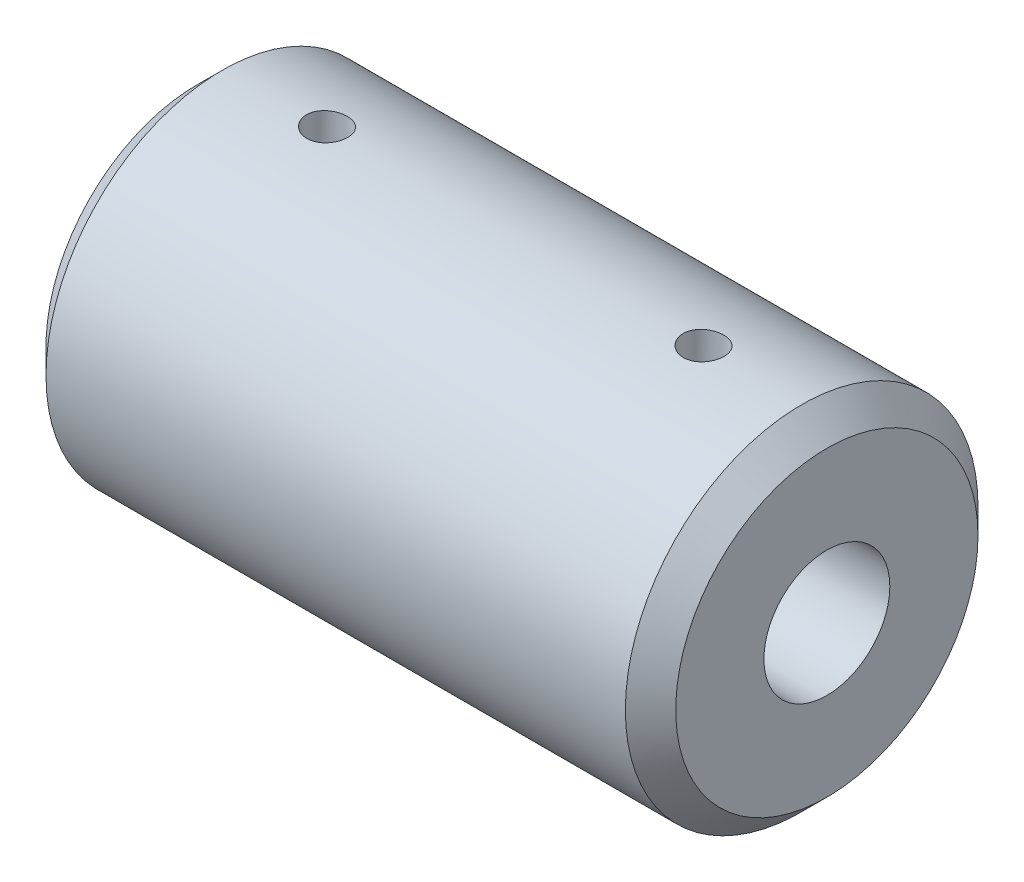
ISO-10303-21;
HEADER;
FILE_DESCRIPTION(('STEP AP214'),'2;1');
FILE_NAME('part.step','',(''),(''),'','','');
FILE_SCHEMA(('AUTOMOTIVE_DESIGN { 1 0 10303 214 1 1 1 1 }'));
ENDSEC;
DATA;
#1=APPLICATION_CONTEXT('core data for automotive mechanical design processes');
#2=APPLICATION_PROTOCOL_DEFINITION('international standard','automotive_design',2000,#1);
#3=PRODUCT_CONTEXT('',#1,'mechanical');
#4=PRODUCT('Part','Part','',(#3));
#5=PRODUCT_RELATED_PRODUCT_CATEGORY('part','',(#4));
#6=PRODUCT_DEFINITION_FORMATION('','',#4);
#7=PRODUCT_DEFINITION_CONTEXT('part definition',#1,'design');
#8=PRODUCT_DEFINITION('design','',#6,#7);
#9=PRODUCT_DEFINITION_SHAPE('','',#8);
#10=(LENGTH_UNIT() NAMED_UNIT(*) SI_UNIT(.MILLI.,.METRE.));
#11=(NAMED_UNIT(*) PLANE_ANGLE_UNIT() SI_UNIT($,.RADIAN.));
#12=(NAMED_UNIT(*) SI_UNIT($,.STERADIAN.) SOLID_ANGLE_UNIT());
#13=UNCERTAINTY_MEASURE_WITH_UNIT(LENGTH_MEASURE(1.E-05),#10,'distance_accuracy_value','');
#14=(GEOMETRIC_REPRESENTATION_CONTEXT(3) GLOBAL_UNCERTAINTY_ASSIGNED_CONTEXT((#13)) GLOBAL_UNIT_ASSIGNED_CONTEXT((#10,
#11,#12)) REPRESENTATION_CONTEXT('',''));
#15=CARTESIAN_POINT('',(0.,0.,0.));
#16=DIRECTION('',(0.,0.,1.));
#17=DIRECTION('',(1.,0.,0.));
#18=AXIS2_PLACEMENT_3D('',#15,#16,#17);
#19=CARTESIAN_POINT('',(25.,0.,0.));
#20=DIRECTION('',(-1.,0.,0.));
#21=DIRECTION('',(0.,0.,1.));
#22=AXIS2_PLACEMENT_3D('',#19,#20,#21);
#23=CYLINDRICAL_SURFACE('',#22,7.);
#24=CARTESIAN_POINT('',(20.,6.96538869352867,0.695241215739531));
#25=CARTESIAN_POINT('',(19.955221364251,6.96538925839416,0.695239285953402));
#26=CARTESIAN_POINT('',(19.9104140020312,6.9657690362752,0.691462776120836));
#27=CARTESIAN_POINT('',(19.822044131321,6.96724200480922,0.676456572404508));
#28=CARTESIAN_POINT('',(19.7784830081984,6.96833595948155,0.665218896418912));
#29=CARTESIAN_POINT('',(19.6938979878882,6.97109743183187,0.63562572567224));
#30=CARTESIAN_POINT('',(19.6528724722858,6.97276457910044,0.617274826655859));
#31=CARTESIAN_POINT('',(19.5744871735817,6.97646095200438,0.573987983750679));
#32=CARTESIAN_POINT('',(19.5371267194929,6.97849011117137,0.549053248305771));
#33=CARTESIAN_POINT('',(19.4669481745153,6.98266105415699,0.493183832896569));
#34=CARTESIAN_POINT('',(19.4341497888337,6.98480327457963,0.462224430883516));
#35=CARTESIAN_POINT('',(19.3741963910025,6.98891323433626,0.395240979401169));
#36=CARTESIAN_POINT('',(19.3470416491577,6.99088096531041,0.359216687485229));
#37=CARTESIAN_POINT('',(19.2990767037635,6.99438089694422,0.283006515803443));
#38=CARTESIAN_POINT('',(19.278284176785,6.99591188338329,0.242809449620369));
#39=CARTESIAN_POINT('',(19.2437470375765,6.99830717949623,0.159475052535296));
#40=CARTESIAN_POINT('',(19.230002204787,6.99917151003371,0.116337813694652));
#41=CARTESIAN_POINT('',(19.2100090629886,7.00007873815906,0.028550191831092));
#42=CARTESIAN_POINT('',(19.2037281405702,7.00012522171129,-0.0160927252066312));
#43=CARTESIAN_POINT('',(19.1987401114317,6.99934420645058,-0.105791359082252));
#44=CARTESIAN_POINT('',(19.2000327529574,6.99851673668962,-0.150847062148953));
#45=CARTESIAN_POINT('',(19.2101288690891,6.99603004105086,-0.239870894467514));
#46=CARTESIAN_POINT('',(19.2188972718336,6.99437471395835,-0.283843117243878));
#47=CARTESIAN_POINT('',(19.2436412681985,6.99036381958259,-0.369676697891015));
#48=CARTESIAN_POINT('',(19.2596169794827,6.9880082408675,-0.411538021287656));
#49=CARTESIAN_POINT('',(19.2983599236096,6.98280014790737,-0.492073057049043));
#50=CARTESIAN_POINT('',(19.3211424895972,6.97994651784992,-0.530739318476951));
#51=CARTESIAN_POINT('',(19.3728412862227,6.97401450959707,-0.603708408600039));
#52=CARTESIAN_POINT('',(19.4017577520671,6.97093612278626,-0.638011069890793));
#53=CARTESIAN_POINT('',(19.4651003222049,6.96483592108967,-0.7014879410634));
#54=CARTESIAN_POINT('',(19.49955696716,6.9618145300125,-0.730631724116504));
#55=CARTESIAN_POINT('',(19.5728964430676,6.95614987888132,-0.78273099332546));
#56=CARTESIAN_POINT('',(19.611779284114,6.95350661968966,-0.805686465368742));
#57=CARTESIAN_POINT('',(19.6928928241026,6.94886807581585,-0.844761300259147));
#58=CARTESIAN_POINT('',(19.7351245856321,6.9468729978284,-0.860878482984606));
#59=CARTESIAN_POINT('',(19.8217242306132,6.94373997334948,-0.885795867976903));
#60=CARTESIAN_POINT('',(19.866092028422,6.9426019925237,-0.894596363343199));
#61=CARTESIAN_POINT('',(19.9554362895972,6.9413067028803,-0.904592157429438));
#62=CARTESIAN_POINT('',(20.0004079061996,6.94114389703032,-0.905830086897612));
#63=CARTESIAN_POINT('',(20.0899182903648,6.94180129102909,-0.900778035892552));
#64=CARTESIAN_POINT('',(20.1344570655931,6.94262147343711,-0.894488188981322));
#65=CARTESIAN_POINT('',(20.2217110841727,6.94515546264809,-0.874593997091442));
#66=CARTESIAN_POINT('',(20.2644310614229,6.94686677388075,-0.861010075578955));
#67=CARTESIAN_POINT('',(20.3469824835424,6.95100537608892,-0.826932371766027));
#68=CARTESIAN_POINT('',(20.3868138427959,6.95343268827521,-0.80643838475944));
#69=CARTESIAN_POINT('',(20.4626512480253,6.95876912039641,-0.759013890761151));
#70=CARTESIAN_POINT('',(20.4986395651425,6.96168032721783,-0.732055270629953));
#71=CARTESIAN_POINT('',(20.5655889233034,6.96768486145551,-0.672503536171158));
#72=CARTESIAN_POINT('',(20.5965498013104,6.9707781947736,-0.639910239185194));
#73=CARTESIAN_POINT('',(20.6527141932698,6.97685744363171,-0.569825311814617));
#74=CARTESIAN_POINT('',(20.6778897350807,6.97984278081407,-0.532311205771822));
#75=CARTESIAN_POINT('',(20.7215757516774,6.98540212562178,-0.453556282285454));
#76=CARTESIAN_POINT('',(20.7400863416075,6.98797614035274,-0.41231552923904));
#77=CARTESIAN_POINT('',(20.7698702644959,6.99246965270981,-0.327370514788207));
#78=CARTESIAN_POINT('',(20.7811600940248,6.99439063750797,-0.28367211862554));
#79=CARTESIAN_POINT('',(20.7962357678077,6.99742479669428,-0.194972692693371));
#80=CARTESIAN_POINT('',(20.8000218922175,6.99853800124046,-0.149971711620372));
#81=CARTESIAN_POINT('',(20.7999780410009,6.99988406818172,-0.0602177962375493));
#82=CARTESIAN_POINT('',(20.7961913281802,7.0001219093855,-0.0154649092355182));
#83=CARTESIAN_POINT('',(20.781200508537,6.99976078144271,0.0727767154692455));
#84=CARTESIAN_POINT('',(20.769996401376,6.99916181225797,0.116265453114302));
#85=CARTESIAN_POINT('',(20.7405017141113,6.99724872389234,0.200739440982885));
#86=CARTESIAN_POINT('',(20.7222128466136,6.99593477751256,0.241725293461626));
#87=CARTESIAN_POINT('',(20.6790722934083,6.99278913757714,0.320060456001504));
#88=CARTESIAN_POINT('',(20.6542205820971,6.9909574420016,0.357409751874615));
#89=CARTESIAN_POINT('',(20.5984985952844,6.98701495271322,0.427630242909399));
#90=CARTESIAN_POINT('',(20.5675960872779,6.98490268468076,0.460475778948456));
#91=CARTESIAN_POINT('',(20.5007156067257,6.98068440306025,0.520532526873109));
#92=CARTESIAN_POINT('',(20.4647364272605,6.97857839108141,0.547742395137108));
#93=CARTESIAN_POINT('',(20.3885921505397,6.97463816418728,0.59582560907302));
#94=CARTESIAN_POINT('',(20.3484138402551,6.97280485405007,0.616678092056966));
#95=CARTESIAN_POINT('',(20.2651302650528,6.96965631316451,0.65130322133391));
#96=CARTESIAN_POINT('',(20.2220282975461,6.9683405097794,0.665083698192455));
#97=CARTESIAN_POINT('',(20.1489111492484,6.96671932448092,0.681809572172233));
#98=CARTESIAN_POINT('',(20.1193601819325,6.96622302712169,0.686839331088369));
#99=CARTESIAN_POINT('',(20.0598770904353,6.96555752374466,0.693555788201022));
#100=CARTESIAN_POINT('',(20.0299449685188,6.96538831578426,0.695242506251935));
#101=CARTESIAN_POINT('',(20.,6.96538869352867,0.695241215739531));
#102=B_SPLINE_CURVE_WITH_KNOTS('',3,(#24,#25,#26,#27,#28,#29,#30,#31,#32,#33,#34,#35,#36,#37,
#38,#39,#40,#41,#42,#43,#44,#45,#46,#47,#48,#49,#50,#51,#52,#53,#54,#55,#56,#57,#58,#59,#60,#61,
#62,#63,#64,#65,#66,#67,#68,#69,#70,#71,#72,#73,#74,#75,#76,#77,#78,#79,#80,#81,#82,#83,#84,#85,
#86,#87,#88,#89,#90,#91,#92,#93,#94,#95,#96,#97,#98,#99,#100,#101),.UNSPECIFIED.,.T.,.F.,(4,2,2,
2,2,2,2,2,2,2,2,2,2,2,2,2,2,2,2,2,2,2,2,2,2,2,2,2,2,2,2,2,2,2,2,2,2,2,4),(0.,0.134226532267942,
0.268596894592968,0.402880586594352,0.537139648330196,0.671961720103514,0.806790247751585,
0.941990046594601,1.0771856140657,1.21178824923483,1.34638641008098,1.4803565686245,
1.61432891439222,1.74860535170543,1.88288693882488,2.01793588104796,2.1529851312503,
2.2880774043422,2.42316426550677,2.55748892399054,2.69181119924671,2.82575931745103,
2.95971140412898,3.09425693171072,3.22880682165022,3.36399418052668,3.49917920378686,
3.63405426922176,3.7689242989137,3.90302603165032,4.03712777050519,4.17119711302067,
4.30526697858673,4.44007147888764,4.57490808155491,4.71018252196539,4.84530685315236,
4.93506914911104,5.02483091196778),.UNSPECIFIED.);
#103=CARTESIAN_POINT('',(20.,6.96538869352867,0.695241215739531));
#104=VERTEX_POINT('',#103);
#105=EDGE_CURVE('E124',#104,#104,#102,.T.);
#106=ORIENTED_EDGE('',*,*,#105,.T.);
#107=EDGE_LOOP('',(#106));
#108=FACE_BOUND('',#107,.T.);
#109=CARTESIAN_POINT('',(5.,6.97042438267503,0.64279384363067));
#110=CARTESIAN_POINT('',(4.95522136425099,6.97042493299924,0.642791909647529));
#111=CARTESIAN_POINT('',(4.91041400203123,6.970776274768,0.63901264824933));
#112=CARTESIAN_POINT('',(4.82204413132101,6.97213625161118,0.623995782755354));
#113=CARTESIAN_POINT('',(4.77848300819841,6.97314559060294,0.61275019103317));
#114=CARTESIAN_POINT('',(4.69389798788819,6.97568424034319,0.583137073299982));
#115=CARTESIAN_POINT('',(4.65287247228576,6.9772132152844,0.564774145691518));
#116=CARTESIAN_POINT('',(4.57448717358165,6.98058366840321,0.521460706817232));
#117=CARTESIAN_POINT('',(4.53712671949286,6.98242508921016,0.496511404461368));
#118=CARTESIAN_POINT('',(4.46694817451531,6.98617539139459,0.440612177480301));
#119=CARTESIAN_POINT('',(4.43414978883369,6.98808452328372,0.409637528220382));
#120=CARTESIAN_POINT('',(4.37419639100247,6.99169018989835,0.342625039011629));
#121=CARTESIAN_POINT('',(4.34704164915768,6.99338671443939,0.30658695668594));
#122=CARTESIAN_POINT('',(4.29907670376348,6.99631292175242,0.23035260025808));
#123=CARTESIAN_POINT('',(4.27828417678503,6.99754130613933,0.190145149194863));
#124=CARTESIAN_POINT('',(4.2437470375765,6.9993092859996,0.10679508363871));
#125=CARTESIAN_POINT('',(4.23000220478696,6.9998489030289,0.0636525610474829));
#126=CARTESIAN_POINT('',(4.2100090629886,7.00009533814513,-0.0241394026226872));
#127=CARTESIAN_POINT('',(4.20372814057022,6.99980579829044,-0.0687814049190696));
#128=CARTESIAN_POINT('',(4.19874011143168,6.99834965387703,-0.158471619253954));
#129=CARTESIAN_POINT('',(4.20003275295743,6.99718307847313,-0.203519817740321));
#130=CARTESIAN_POINT('',(4.21012886908908,6.99402638115268,-0.292522411173941));
#131=CARTESIAN_POINT('',(4.21889727183355,6.99204012709952,-0.336480928875447));
#132=CARTESIAN_POINT('',(4.2436412681985,6.98738328687522,-0.422281888540987));
#133=CARTESIAN_POINT('',(4.2596169794827,6.98471268953207,-0.464124295945818));
#134=CARTESIAN_POINT('',(4.29835992360963,6.97889856617346,-0.544617849643864));
#135=CARTESIAN_POINT('',(4.32114248959717,6.97575398045957,-0.583261536812715));
#136=CARTESIAN_POINT('',(4.37284128622265,6.96927291031551,-0.65618391036906));
#137=CARTESIAN_POINT('',(4.40175775206706,6.96593641853022,-0.690462429292023));
#138=CARTESIAN_POINT('',(4.46510032220488,6.95935860654471,-0.753891586815091));
#139=CARTESIAN_POINT('',(4.49955696715997,6.9561179391603,-0.783011802638317));
#140=CARTESIAN_POINT('',(4.57289644306764,6.95006130330055,-0.835066958834488));
#141=CARTESIAN_POINT('',(4.61177928411396,6.94724533579376,-0.858001885101753));
#142=CARTESIAN_POINT('',(4.69289282410262,6.94231281154011,-0.897040699318745));
#143=CARTESIAN_POINT('',(4.73512458563211,6.94019647789163,-0.913142408764333));
#144=CARTESIAN_POINT('',(4.82172423061325,6.93687599187875,-0.938035505997866));
#145=CARTESIAN_POINT('',(4.866092028422,6.93567180297489,-0.946827186618536));
#146=CARTESIAN_POINT('',(4.95543628959718,6.93430131283389,-0.956812948054112));
#147=CARTESIAN_POINT('',(5.00040790619961,6.93412919384337,-0.9580496170341));
#148=CARTESIAN_POINT('',(5.08991829036478,6.9348245954254,-0.953002657269344));
#149=CARTESIAN_POINT('',(5.1344570655931,6.93569209755241,-0.946719161951546));
#150=CARTESIAN_POINT('',(5.22171108417274,6.93837575627104,-0.926844606657034));
#151=CARTESIAN_POINT('',(5.26443106142289,6.94018926363799,-0.913273950784068));
#152=CARTESIAN_POINT('',(5.34698248354243,6.94458424755849,-0.879228363085548));
#153=CARTESIAN_POINT('',(5.38681384279593,6.94716574686303,-0.858753226719297));
#154=CARTESIAN_POINT('',(5.46265124802526,6.95285898651627,-0.811370242842925));
#155=CARTESIAN_POINT('',(5.49863956514249,6.95597302529674,-0.784434298697432));
#156=CARTESIAN_POINT('',(5.56558892330345,6.96242562848181,-0.724929446621332));
#157=CARTESIAN_POINT('',(5.59654980131041,6.96576420016291,-0.692360356081953));
#158=CARTESIAN_POINT('',(5.65271419326981,6.97237079798073,-0.622323171840355));
#159=CARTESIAN_POINT('',(5.67788973508066,6.97563841494785,-0.584832598763399));
#160=CARTESIAN_POINT('',(5.72157575167746,6.98179038150409,-0.506121750746588));
#161=CARTESIAN_POINT('',(5.74008634160748,6.98467473771391,-0.46490154025555));
#162=CARTESIAN_POINT('',(5.76987026449595,6.98980749411288,-0.379992754225454));
#163=CARTESIAN_POINT('',(5.78116009402477,6.99205733728494,-0.336310054955775));
#164=CARTESIAN_POINT('',(5.79623576780771,6.99575904087525,-0.247635979413969));
#165=CARTESIAN_POINT('',(5.80002189221753,6.99721093108412,-0.202644652063962));
#166=CARTESIAN_POINT('',(5.79997804100093,6.99923252726916,-0.112903410866718));
#167=CARTESIAN_POINT('',(5.79619132818022,6.99980721155692,-0.0681535818008518));
#168=CARTESIAN_POINT('',(5.78120050853698,7.00011027838071,0.0200882614166817));
#169=CARTESIAN_POINT('',(5.76999640137604,6.99983866087812,0.0635802755109624));
#170=CARTESIAN_POINT('',(5.74050171411127,6.99856145267393,0.148066270046858));
#171=CARTESIAN_POINT('',(5.72221284661364,6.99755603930165,0.189060851425974));
#172=CARTESIAN_POINT('',(5.67907229340834,6.99500010821207,0.267417471803692));
#173=CARTESIAN_POINT('',(5.65422058209713,6.99344958836815,0.304779496629874));
#174=CARTESIAN_POINT('',(5.59849859528442,6.99003575230132,0.375027673163246));
#175=CARTESIAN_POINT('',(5.56759608727795,6.98817076866729,0.407888177571712));
#176=CARTESIAN_POINT('',(5.50071560672574,6.98440464675807,0.467974974764442));
#177=CARTESIAN_POINT('',(5.46473642726052,6.98250349997877,0.495199923953058));
#178=CARTESIAN_POINT('',(5.38859215053971,6.97892530150933,0.543311433450237));
#179=CARTESIAN_POINT('',(5.34841384025506,6.9772489975406,0.56417712485166));
#180=CARTESIAN_POINT('',(5.26513026505277,6.97436116520154,0.598824971993072));
#181=CARTESIAN_POINT('',(5.22202829754609,6.97314912315043,0.612614962386959));
#182=CARTESIAN_POINT('',(5.14891114924843,6.97165387750121,0.629352565041102));
#183=CARTESIAN_POINT('',(5.1193601819325,6.97119545261634,0.634385917050266));
#184=CARTESIAN_POINT('',(5.05987709043531,6.97058052208971,0.641107193070365));
#185=CARTESIAN_POINT('',(5.0299449685188,6.97042401465485,0.642795136949756));
#186=CARTESIAN_POINT('',(5.,6.97042438267503,0.64279384363067));
#187=B_SPLINE_CURVE_WITH_KNOTS('',3,(#109,#110,#111,#112,#113,#114,#115,#116,#117,#118,#119,
#120,#121,#122,#123,#124,#125,#126,#127,#128,#129,#130,#131,#132,#133,#134,#135,#136,#137,#138,
#139,#140,#141,#142,#143,#144,#145,#146,#147,#148,#149,#150,#151,#152,#153,#154,#155,#156,#157,
#158,#159,#160,#161,#162,#163,#164,#165,#166,#167,#168,#169,#170,#171,#172,#173,#174,#175,#176,
#177,#178,#179,#180,#181,#182,#183,#184,#185,#186),.UNSPECIFIED.,.T.,.F.,(4,2,2,2,2,2,2,2,2,2,2,
2,2,2,2,2,2,2,2,2,2,2,2,2,2,2,2,2,2,2,2,2,2,2,2,2,2,2,4),(0.,0.134226532267945,0.26859689459297,
0.402880586594355,0.537139648330204,0.671961720103522,0.806790247751593,0.941990046594609,
1.07718561406571,1.21178824923484,1.34638641008099,1.48035656862452,1.61432891439223,
1.74860535170544,1.8828869388249,2.01793588104798,2.15298513125032,2.28807740434222,
2.42316426550678,2.55748892399056,2.69181119924673,2.82575931745105,2.959711404129,
3.09425693171074,3.22880682165024,3.36399418052671,3.49917920378689,3.63405426922178,
3.76892429891373,3.90302603165034,4.03712777050522,4.1711971130207,4.30526697858676,
4.44007147888766,4.57490808155494,4.71018252196542,4.84530685315239,4.93506914911108,
5.02483091196781),.UNSPECIFIED.);
#188=CARTESIAN_POINT('',(5.,6.97042438267503,0.64279384363067));
#189=VERTEX_POINT('',#188);
#190=EDGE_CURVE('E69',#189,#189,#187,.T.);
#191=ORIENTED_EDGE('',*,*,#190,.T.);
#192=EDGE_LOOP('',(#191));
#193=FACE_BOUND('',#192,.T.);
#194=CARTESIAN_POINT('',(1.,0.,0.));
#195=DIRECTION('',(1.,0.,0.));
#196=DIRECTION('',(0.,0.,-1.));
#197=AXIS2_PLACEMENT_3D('',#194,#195,#196);
#198=CIRCLE('',#197,7.);
#199=CARTESIAN_POINT('',(1.,0.,-7.));
#200=VERTEX_POINT('',#199);
#201=EDGE_CURVE('E46',#200,#200,#198,.T.);
#202=ORIENTED_EDGE('',*,*,#201,.T.);
#203=EDGE_LOOP('',(#202));
#204=FACE_BOUND('',#203,.T.);
#205=CARTESIAN_POINT('',(24.,0.,0.));
#206=DIRECTION('',(1.,0.,0.));
#207=DIRECTION('',(0.,0.,-1.));
#208=AXIS2_PLACEMENT_3D('',#205,#206,#207);
#209=CIRCLE('',#208,7.);
#210=CARTESIAN_POINT('',(24.,0.,-7.));
#211=VERTEX_POINT('',#210);
#212=EDGE_CURVE('E50',#211,#211,#209,.F.);
#213=ORIENTED_EDGE('',*,*,#212,.T.);
#214=EDGE_LOOP('',(#213));
#215=FACE_BOUND('',#214,.T.);
#216=ADVANCED_FACE('F39',(#108,#193,#204,#215),#23,.T.);
#217=CARTESIAN_POINT('',(25.,0.,0.));
#218=DIRECTION('',(1.,0.,0.));
#219=DIRECTION('',(0.,0.,-1.));
#220=AXIS2_PLACEMENT_3D('',#217,#218,#219);
#221=PLANE('',#220);
#222=CARTESIAN_POINT('',(25.,0.,0.));
#223=DIRECTION('',(1.,0.,0.));
#224=DIRECTION('',(0.,0.,-1.));
#225=AXIS2_PLACEMENT_3D('',#222,#223,#224);
#226=CIRCLE('',#225,6.);
#227=CARTESIAN_POINT('',(25.,0.,-6.));
#228=VERTEX_POINT('',#227);
#229=EDGE_CURVE('E54',#228,#228,#226,.T.);
#230=ORIENTED_EDGE('',*,*,#229,.T.);
#231=EDGE_LOOP('',(#230));
#232=FACE_BOUND('',#231,.T.);
#233=CARTESIAN_POINT('',(25.,0.,0.));
#234=DIRECTION('',(1.,0.,0.));
#235=DIRECTION('',(0.,0.,-1.));
#236=AXIS2_PLACEMENT_3D('',#233,#234,#235);
#237=CIRCLE('',#236,2.5);
#238=CARTESIAN_POINT('',(25.,0.,-2.5));
#239=VERTEX_POINT('',#238);
#240=EDGE_CURVE('E59',#239,#239,#237,.T.);
#241=ORIENTED_EDGE('',*,*,#240,.F.);
#242=EDGE_LOOP('',(#241));
#243=FACE_BOUND('',#242,.T.);
#244=ADVANCED_FACE('F110',(#232,#243),#221,.T.);
#245=CARTESIAN_POINT('',(0.,0.,0.));
#246=DIRECTION('',(1.,0.,0.));
#247=DIRECTION('',(0.,0.,-1.));
#248=AXIS2_PLACEMENT_3D('',#245,#246,#247);
#249=PLANE('',#248);
#250=CARTESIAN_POINT('',(0.,0.,0.));
#251=DIRECTION('',(1.,0.,0.));
#252=DIRECTION('',(0.,0.,-1.));
#253=AXIS2_PLACEMENT_3D('',#250,#251,#252);
#254=CIRCLE('',#253,5.99999999999999);
#255=CARTESIAN_POINT('',(0.,0.,-5.99999999999999));
#256=VERTEX_POINT('',#255);
#257=EDGE_CURVE('E11',#256,#256,#254,.F.);
#258=ORIENTED_EDGE('',*,*,#257,.T.);
#259=EDGE_LOOP('',(#258));
#260=FACE_BOUND('',#259,.T.);
#261=CARTESIAN_POINT('',(0.,0.,0.));
#262=DIRECTION('',(-1.,0.,0.));
#263=DIRECTION('',(0.,0.,1.));
#264=AXIS2_PLACEMENT_3D('',#261,#262,#263);
#265=CIRCLE('',#264,4.);
#266=CARTESIAN_POINT('',(0.,0.,4.));
#267=VERTEX_POINT('',#266);
#268=EDGE_CURVE('E66',#267,#267,#265,.T.);
#269=ORIENTED_EDGE('',*,*,#268,.F.);
#270=EDGE_LOOP('',(#269));
#271=FACE_BOUND('',#270,.T.);
#272=ADVANCED_FACE('F108',(#260,#271),#249,.F.);
#273=CARTESIAN_POINT('',(12.5,0.,0.));
#274=DIRECTION('',(1.,0.,0.));
#275=DIRECTION('',(0.,0.,-1.));
#276=AXIS2_PLACEMENT_3D('',#273,#274,#275);
#277=CYLINDRICAL_SURFACE('',#276,2.5);
#278=CARTESIAN_POINT('',(20.,2.38031652672165,0.764259924774144));
#279=CARTESIAN_POINT('',(20.0436831189777,2.38031666241346,0.764259794588971));
#280=CARTESIAN_POINT('',(20.0873677518361,2.3814840462113,0.760651909333103));
#281=CARTESIAN_POINT('',(20.1734497937737,2.38600077673388,0.746361188302271));
#282=CARTESIAN_POINT('',(20.2158469018275,2.38935062967501,0.735676711125992));
#283=CARTESIAN_POINT('',(20.2980940508332,2.39780104162779,0.707645457997033));
#284=CARTESIAN_POINT('',(20.3379486126545,2.40289838436109,0.690310914651972));
#285=CARTESIAN_POINT('',(20.4142088205076,2.41424335814813,0.649519459802784));
#286=CARTESIAN_POINT('',(20.4506138001834,2.42049121076266,0.626061368685341));
#287=CARTESIAN_POINT('',(20.5202531975668,2.43365672614216,0.572791611171812));
#288=CARTESIAN_POINT('',(20.5533450827376,2.44058960752864,0.542797329159613));
#289=CARTESIAN_POINT('',(20.6141432129317,2.45415948384694,0.477708100558981));
#290=CARTESIAN_POINT('',(20.641848667311,2.46079643523083,0.442612406482262));
#291=CARTESIAN_POINT('',(20.6917226926501,2.47317310688479,0.36729206508794));
#292=CARTESIAN_POINT('',(20.7137435746546,2.47888767510302,0.326965118541101));
#293=CARTESIAN_POINT('',(20.7506492819828,2.48852371059697,0.242968322544138));
#294=CARTESIAN_POINT('',(20.7655358708813,2.492445621001,0.199299302342731));
#295=CARTESIAN_POINT('',(20.7872718896142,2.49789442363543,0.11135863205959));
#296=CARTESIAN_POINT('',(20.7943651288308,2.49949450461752,0.0671518807203711));
#297=CARTESIAN_POINT('',(20.8010865527505,2.50030020139406,-0.021842956439276));
#298=CARTESIAN_POINT('',(20.8007165144009,2.49950638719424,-0.0666309013442809));
#299=CARTESIAN_POINT('',(20.7926802490138,2.4956325818156,-0.15379846128206));
#300=CARTESIAN_POINT('',(20.7852785010797,2.49263634957546,-0.19620658049307));
#301=CARTESIAN_POINT('',(20.7638240883794,2.48471942784253,-0.279113801292771));
#302=CARTESIAN_POINT('',(20.749770983172,2.47979861091085,-0.319612776265956));
#303=CARTESIAN_POINT('',(20.7152483837411,2.4684142112477,-0.39815470047696));
#304=CARTESIAN_POINT('',(20.6947004092032,2.46193200251841,-0.436160351636078));
#305=CARTESIAN_POINT('',(20.6478348965507,2.44806695089655,-0.508249664562377));
#306=CARTESIAN_POINT('',(20.6215158462647,2.44068387217801,-0.542332294820417));
#307=CARTESIAN_POINT('',(20.5625061791334,2.42538319097946,-0.607186497569409));
#308=CARTESIAN_POINT('',(20.5295878184712,2.41745631753028,-0.637748956789679));
#309=CARTESIAN_POINT('',(20.4590058695103,2.40220468316946,-0.692990626654768));
#310=CARTESIAN_POINT('',(20.4213416652225,2.39488000062379,-0.717669072376455));
#311=CARTESIAN_POINT('',(20.3417216298531,2.38156196567283,-0.760709184751005));
#312=CARTESIAN_POINT('',(20.2997189623115,2.37558598357398,-0.77898994003413));
#313=CARTESIAN_POINT('',(20.2129895968047,2.36581512539331,-0.808182240131966));
#314=CARTESIAN_POINT('',(20.1682639414075,2.36201942027115,-0.819096586266699));
#315=CARTESIAN_POINT('',(20.0793680449598,2.35720688334473,-0.832842626279218));
#316=CARTESIAN_POINT('',(20.0352531758431,2.35608018578689,-0.835994097917498));
#317=CARTESIAN_POINT('',(19.9471178647318,2.35642325346788,-0.835026952712022));
#318=CARTESIAN_POINT('',(19.9030974084499,2.35789259331381,-0.830909526967224));
#319=CARTESIAN_POINT('',(19.8178114863237,2.36315904255516,-0.815805884401784));
#320=CARTESIAN_POINT('',(19.7765029266495,2.36688307994181,-0.805035081737338));
#321=CARTESIAN_POINT('',(19.6962944201311,2.37617422467868,-0.77718089810769));
#322=CARTESIAN_POINT('',(19.6573948798151,2.38174164210331,-0.760096455070687));
#323=CARTESIAN_POINT('',(19.5818260764188,2.39431887764077,-0.719513695387285));
#324=CARTESIAN_POINT('',(19.5452577205953,2.40136671094015,-0.695839534858209));
#325=CARTESIAN_POINT('',(19.4765132889082,2.41606619936072,-0.64294355217528));
#326=CARTESIAN_POINT('',(19.4443384129959,2.4237180185462,-0.61372021961571));
#327=CARTESIAN_POINT('',(19.3838404446829,2.43920536422817,-0.549025676205707));
#328=CARTESIAN_POINT('',(19.3557475992081,2.44703427116875,-0.513336974790487));
#329=CARTESIAN_POINT('',(19.3059574613617,2.46171236077617,-0.437560760900771));
#330=CARTESIAN_POINT('',(19.2842598959393,2.46856158526477,-0.397473436328668));
#331=CARTESIAN_POINT('',(19.2480820013662,2.48052240018184,-0.314262346052158));
#332=CARTESIAN_POINT('',(19.2335509407931,2.48564612090432,-0.271162464404715));
#333=CARTESIAN_POINT('',(19.2120079479446,2.49369129856487,-0.18292878796037));
#334=CARTESIAN_POINT('',(19.2049935363366,2.49661348157568,-0.137795668939281));
#335=CARTESIAN_POINT('',(19.1988921460501,2.49990062666665,-0.0488873883794006));
#336=CARTESIAN_POINT('',(19.1994733424851,2.50037137847984,-0.00513864825814464));
#337=CARTESIAN_POINT('',(19.2077385423891,2.49904329051011,0.0816433380902363));
#338=CARTESIAN_POINT('',(19.2154220439002,2.49724461111681,0.124676634662803));
#339=CARTESIAN_POINT('',(19.237459135383,2.49166091818865,0.208222591957154));
#340=CARTESIAN_POINT('',(19.2517201862228,2.48790337124171,0.248761653180009));
#341=CARTESIAN_POINT('',(19.2864233047861,2.47884586009203,0.32691366670101));
#342=CARTESIAN_POINT('',(19.3068664559173,2.47354562554075,0.364526104657151));
#343=CARTESIAN_POINT('',(19.3541805538927,2.46176180751513,0.437185953357151));
#344=CARTESIAN_POINT('',(19.3812516181023,2.45524326915673,0.472097317911849));
#345=CARTESIAN_POINT('',(19.4407046379201,2.44187098526665,0.536997316125353));
#346=CARTESIAN_POINT('',(19.4730882198467,2.4350171375392,0.566984436685183));
#347=CARTESIAN_POINT('',(19.5436133228185,2.42149750084627,0.62224499697424));
#348=CARTESIAN_POINT('',(19.5819175010372,2.41484684346921,0.647315159142149));
#349=CARTESIAN_POINT('',(19.662392352835,2.40282168550963,0.690619796627721));
#350=CARTESIAN_POINT('',(19.7045616455159,2.39744673159813,0.708856701522013));
#351=CARTESIAN_POINT('',(19.7884914205569,2.38899020545723,0.736834300671951));
#352=CARTESIAN_POINT('',(19.8300675779564,2.38577268602435,0.747087112998846));
#353=CARTESIAN_POINT('',(19.9144288994281,2.38143607231141,0.760799043094671));
#354=CARTESIAN_POINT('',(19.9572137235356,2.38031639381568,0.764260052286531));
#355=CARTESIAN_POINT('',(20.,2.38031652672165,0.764259924774144));
#356=B_SPLINE_CURVE_WITH_KNOTS('',3,(#278,#279,#280,#281,#282,#283,#284,#285,#286,#287,#288,
#289,#290,#291,#292,#293,#294,#295,#296,#297,#298,#299,#300,#301,#302,#303,#304,#305,#306,#307,
#308,#309,#310,#311,#312,#313,#314,#315,#316,#317,#318,#319,#320,#321,#322,#323,#324,#325,#326,
#327,#328,#329,#330,#331,#332,#333,#334,#335,#336,#337,#338,#339,#340,#341,#342,#343,#344,#345,
#346,#347,#348,#349,#350,#351,#352,#353,#354,#355),.UNSPECIFIED.,.T.,.F.,(4,2,2,2,2,2,2,2,2,2,2,
2,2,2,2,2,2,2,2,2,2,2,2,2,2,2,2,2,2,2,2,2,2,2,2,2,2,2,4),(0.,0.13089116852366,0.261812707628657,
0.392494566159151,0.523201617269214,0.658181086047285,0.793180352769154,0.931396887417812,
1.06957923772487,1.2033033720603,1.33699566811543,1.46585063697653,1.59471413958248,
1.72519845034167,1.85571699231552,1.99192534158373,2.12815138832633,2.26604280905127,
2.40388176242562,2.53593995660064,2.66797651341175,2.79594728163426,2.92393958672762,
3.05574326637468,3.18758287266623,3.32519336185684,3.4627979748266,3.5994139843442,
3.7359849178059,3.8666102640142,3.99722637893299,4.12605842929878,4.2549130704665,
4.3882824567726,4.52169274783301,4.65980300496362,4.79786411004769,4.9261037167632,
5.05430760545671),.UNSPECIFIED.);
#357=CARTESIAN_POINT('',(20.,2.38031652672165,0.764259924774144));
#358=VERTEX_POINT('',#357);
#359=EDGE_CURVE('E201',#358,#358,#356,.T.);
#360=ORIENTED_EDGE('',*,*,#359,.T.);
#361=EDGE_LOOP('',(#360));
#362=FACE_BOUND('',#361,.T.);
#363=CARTESIAN_POINT('',(12.5,0.,0.));
#364=DIRECTION('',(-1.,0.,0.));
#365=DIRECTION('',(0.,0.,1.));
#366=AXIS2_PLACEMENT_3D('',#363,#364,#365);
#367=CIRCLE('',#366,2.5);
#368=CARTESIAN_POINT('',(12.5,0.,2.5));
#369=VERTEX_POINT('',#368);
#370=EDGE_CURVE('E62',#369,#369,#367,.F.);
#371=ORIENTED_EDGE('',*,*,#370,.F.);
#372=EDGE_LOOP('',(#371));
#373=FACE_BOUND('',#372,.T.);
#374=ORIENTED_EDGE('',*,*,#240,.T.);
#375=EDGE_LOOP('',(#374));
#376=FACE_BOUND('',#375,.T.);
#377=ADVANCED_FACE('F100',(#362,#373,#376),#277,.F.);
#378=CARTESIAN_POINT('',(12.5,0.,0.));
#379=DIRECTION('',(-1.,0.,0.));
#380=DIRECTION('',(0.,0.,1.));
#381=AXIS2_PLACEMENT_3D('',#378,#379,#380);
#382=PLANE('',#381);
#383=CARTESIAN_POINT('',(12.5,0.,0.));
#384=DIRECTION('',(-1.,0.,0.));
#385=DIRECTION('',(0.,0.,1.));
#386=AXIS2_PLACEMENT_3D('',#383,#384,#385);
#387=CIRCLE('',#386,4.);
#388=CARTESIAN_POINT('',(12.5,0.,4.));
#389=VERTEX_POINT('',#388);
#390=EDGE_CURVE('E65',#389,#389,#387,.T.);
#391=ORIENTED_EDGE('',*,*,#390,.T.);
#392=EDGE_LOOP('',(#391));
#393=FACE_BOUND('',#392,.T.);
#394=ORIENTED_EDGE('',*,*,#370,.T.);
#395=EDGE_LOOP('',(#394));
#396=FACE_BOUND('',#395,.T.);
#397=ADVANCED_FACE('F96',(#393,#396),#382,.T.);
#398=CARTESIAN_POINT('',(12.5,0.,0.));
#399=DIRECTION('',(-1.,0.,0.));
#400=DIRECTION('',(0.,0.,1.));
#401=AXIS2_PLACEMENT_3D('',#398,#399,#400);
#402=CYLINDRICAL_SURFACE('',#401,4.);
#403=CARTESIAN_POINT('',(5.,3.93624608615121,0.711313397356798));
#404=CARTESIAN_POINT('',(5.04445150038558,3.93624693272383,0.711311734520881));
#405=CARTESIAN_POINT('',(5.0889236986452,3.93692644114228,0.707579622788032));
#406=CARTESIAN_POINT('',(5.17661000409473,3.93955999984713,0.692763678487624));
#407=CARTESIAN_POINT('',(5.21982307570486,3.94151506994978,0.681673963369085));
#408=CARTESIAN_POINT('',(5.30370984269034,3.94644837450596,0.65250469857145));
#409=CARTESIAN_POINT('',(5.34438601722794,3.94942559095754,0.634432101224175));
#410=CARTESIAN_POINT('',(5.4221398757557,3.95603250662506,0.591835515518266));
#411=CARTESIAN_POINT('',(5.45921776042982,3.9596621694205,0.567311887230177));
#412=CARTESIAN_POINT('',(5.5292488030836,3.96717624891756,0.512147588109041));
#413=CARTESIAN_POINT('',(5.56214367030732,3.97106331320412,0.481433266039673));
#414=CARTESIAN_POINT('',(5.62236602686305,3.97856162142231,0.414927933125931));
#415=CARTESIAN_POINT('',(5.64969312593372,3.98217284600845,0.379136566714537));
#416=CARTESIAN_POINT('',(5.69823041410281,3.98868240463633,0.303114591604407));
#417=CARTESIAN_POINT('',(5.71938521105332,3.99157425064799,0.262848008822034));
#418=CARTESIAN_POINT('',(5.7546199496385,3.99619977224855,0.179267541711462));
#419=CARTESIAN_POINT('',(5.76870055352079,3.99793355625393,0.135953943061319));
#420=CARTESIAN_POINT('',(5.7892057548957,3.99994849457877,0.0481195776554094));
#421=CARTESIAN_POINT('',(5.79572878205681,4.00024848748332,0.00362223564438399));
#422=CARTESIAN_POINT('',(5.80124076147065,3.99932923064181,-0.0858191446918411));
#423=CARTESIAN_POINT('',(5.80023043971666,3.99811012730139,-0.130763139555962));
#424=CARTESIAN_POINT('',(5.79077905582756,3.99423393296761,-0.21914654809724));
#425=CARTESIAN_POINT('',(5.78244401826572,3.99159756730188,-0.262598273554478));
#426=CARTESIAN_POINT('',(5.75874797403289,3.98510897614246,-0.347444938109638));
#427=CARTESIAN_POINT('',(5.7433866862465,3.98125670200303,-0.388839794840201));
#428=CARTESIAN_POINT('',(5.70597596788219,3.97264908916181,-0.468704810601082));
#429=CARTESIAN_POINT('',(5.68388499911609,3.96788821239509,-0.507154894399432));
#430=CARTESIAN_POINT('',(5.63367273821072,3.95792189004611,-0.57982910778661));
#431=CARTESIAN_POINT('',(5.60555075218359,3.9527163933504,-0.614052750395254));
#432=CARTESIAN_POINT('',(5.54349310231322,3.94226687726822,-0.677937782383814));
#433=CARTESIAN_POINT('',(5.50946465061633,3.93702376785845,-0.70750925551503));
#434=CARTESIAN_POINT('',(5.4368668460394,3.92712274097613,-0.760550582764654));
#435=CARTESIAN_POINT('',(5.39829740729344,3.92246483457268,-0.784020321477904));
#436=CARTESIAN_POINT('',(5.31758333454256,3.91421356041303,-0.824230823235994));
#437=CARTESIAN_POINT('',(5.27543122588827,3.91062249221667,-0.840957078061706));
#438=CARTESIAN_POINT('',(5.18882294102081,3.90491091169031,-0.867093745776394));
#439=CARTESIAN_POINT('',(5.14436706590473,3.90279020770536,-0.876505112145456));
#440=CARTESIAN_POINT('',(5.05522811360076,3.90027845166179,-0.887614921718128));
#441=CARTESIAN_POINT('',(5.01056194055173,3.89985842405164,-0.889442586972473));
#442=CARTESIAN_POINT('',(4.92156142144025,3.90071426313255,-0.885681565983036));
#443=CARTESIAN_POINT('',(4.87722705670491,3.90199003365782,-0.880093300283918));
#444=CARTESIAN_POINT('',(4.79058508776621,3.90607749186824,-0.861768219183919));
#445=CARTESIAN_POINT('',(4.74826212557139,3.9088743344949,-0.849100464331731));
#446=CARTESIAN_POINT('',(4.66634937677701,3.91569970454207,-0.817045120490378));
#447=CARTESIAN_POINT('',(4.62675981565142,3.91972833342228,-0.797656977939216));
#448=CARTESIAN_POINT('',(4.55086951203987,3.92866555559917,-0.752411859369835));
#449=CARTESIAN_POINT('',(4.51461836295934,3.93358493417461,-0.726473860588601));
#450=CARTESIAN_POINT('',(4.44695335039927,3.94377191825539,-0.668964787230347));
#451=CARTESIAN_POINT('',(4.4155399854006,3.94903955956559,-0.63739313288913));
#452=CARTESIAN_POINT('',(4.35794995265154,3.95948751515451,-0.568923457000563));
#453=CARTESIAN_POINT('',(4.33186107628,3.96466524753224,-0.531951110225606));
#454=CARTESIAN_POINT('',(4.28628329480033,3.97433885169714,-0.454057973493044));
#455=CARTESIAN_POINT('',(4.26679411252418,3.9788347521149,-0.413137349444407));
#456=CARTESIAN_POINT('',(4.23509690260269,3.98669277626739,-0.328732769147852));
#457=CARTESIAN_POINT('',(4.222847585419,3.99006128088541,-0.285264933918886));
#458=CARTESIAN_POINT('',(4.20584700186893,3.99540103629922,-0.196805166156376));
#459=CARTESIAN_POINT('',(4.20109483241946,3.99737245536782,-0.151813417855681));
#460=CARTESIAN_POINT('',(4.19925841522969,3.9997585856991,-0.0624194134596908));
#461=CARTESIAN_POINT('',(4.20204217563503,4.00019978855294,-0.0180205230446894));
#462=CARTESIAN_POINT('',(4.21490716043825,3.9996333151161,0.0696955993210069));
#463=CARTESIAN_POINT('',(4.22498829307846,3.99862565704335,0.113012844865295));
#464=CARTESIAN_POINT('',(4.25210319367332,3.99535563702677,0.197250062627923));
#465=CARTESIAN_POINT('',(4.26912110250495,3.99309613289643,0.238175261211535));
#466=CARTESIAN_POINT('',(4.30960979306472,3.98764266666511,0.316629401761967));
#467=CARTESIAN_POINT('',(4.33308108472297,3.98444863071849,0.354158075032277));
#468=CARTESIAN_POINT('',(4.38625550964967,3.97747880268352,0.425400729993562));
#469=CARTESIAN_POINT('',(4.41605306910942,3.97369445672227,0.459043404430467));
#470=CARTESIAN_POINT('',(4.48084019207662,3.96606090299764,0.520897833092513));
#471=CARTESIAN_POINT('',(4.51583098357499,3.96221168008482,0.549108299183884));
#472=CARTESIAN_POINT('',(4.59046345336014,3.95489135669674,0.599577741885921));
#473=CARTESIAN_POINT('',(4.63015116892829,3.95142477578231,0.62176933878731));
#474=CARTESIAN_POINT('',(4.71274621863976,3.94536821011873,0.659113383061267));
#475=CARTESIAN_POINT('',(4.75565059095833,3.94277743077398,0.674272215783235));
#476=CARTESIAN_POINT('',(4.83220996434925,3.93931380003427,0.694175081659445));
#477=CARTESIAN_POINT('',(4.86542833560916,3.93817117476305,0.700590320609032));
#478=CARTESIAN_POINT('',(4.93242716364291,3.93663700898246,0.709160037064342));
#479=CARTESIAN_POINT('',(4.96620760099854,3.93624544257969,0.711314661458444));
#480=CARTESIAN_POINT('',(5.,3.93624608615121,0.711313397356798));
#481=B_SPLINE_CURVE_WITH_KNOTS('',3,(#403,#404,#405,#406,#407,#408,#409,#410,#411,#412,#413,
#414,#415,#416,#417,#418,#419,#420,#421,#422,#423,#424,#425,#426,#427,#428,#429,#430,#431,#432,
#433,#434,#435,#436,#437,#438,#439,#440,#441,#442,#443,#444,#445,#446,#447,#448,#449,#450,#451,
#452,#453,#454,#455,#456,#457,#458,#459,#460,#461,#462,#463,#464,#465,#466,#467,#468,#469,#470,
#471,#472,#473,#474,#475,#476,#477,#478,#479,#480),.UNSPECIFIED.,.T.,.F.,(4,2,2,2,2,2,2,2,2,2,2,
2,2,2,2,2,2,2,2,2,2,2,2,2,2,2,2,2,2,2,2,2,2,2,2,2,2,2,4),(0.,0.133230771085219,
0.266568191407411,0.399773198332442,0.532970771867864,0.667858020367468,0.802754720263349,
0.938827203479575,1.07488694595245,1.20915399104462,1.34340809690996,1.47575031704827,
1.60809783256997,1.7412793937584,1.8744762861405,2.00999477407984,2.14551582496173,
2.28132690536218,2.41712028010817,2.55059006241672,2.68405227620734,2.81623473424652,
2.94842808281516,3.08234447817614,3.21627466294164,3.35226081384758,3.48824125302081,
3.62343850860917,3.75861947751299,3.89144813929746,4.02427513091402,4.15680013658358,
4.28933561705744,4.42400921618474,4.55871471109822,4.6948711886123,4.83090380069143,
4.93219042907513,5.03347356545368),.UNSPECIFIED.);
#482=CARTESIAN_POINT('',(5.,3.93624608615121,0.711313397356798));
#483=VERTEX_POINT('',#482);
#484=EDGE_CURVE('E78',#483,#483,#481,.T.);
#485=ORIENTED_EDGE('',*,*,#484,.T.);
#486=EDGE_LOOP('',(#485));
#487=FACE_BOUND('',#486,.T.);
#488=ORIENTED_EDGE('',*,*,#390,.F.);
#489=EDGE_LOOP('',(#488));
#490=FACE_BOUND('',#489,.T.);
#491=ORIENTED_EDGE('',*,*,#268,.T.);
#492=EDGE_LOOP('',(#491));
#493=FACE_BOUND('',#492,.T.);
#494=ADVANCED_FACE('F99',(#487,#490,#493),#402,.F.);
#495=CARTESIAN_POINT('',(25.,0.,0.));
#496=DIRECTION('',(-1.,0.,0.));
#497=DIRECTION('',(0.,0.,1.));
#498=AXIS2_PLACEMENT_3D('',#495,#496,#497);
#499=CONICAL_SURFACE('',#498,6.,0.785398163397445);
#500=ORIENTED_EDGE('',*,*,#212,.F.);
#501=EDGE_LOOP('',(#500));
#502=FACE_BOUND('',#501,.T.);
#503=ORIENTED_EDGE('',*,*,#229,.F.);
#504=EDGE_LOOP('',(#503));
#505=FACE_BOUND('',#504,.T.);
#506=ADVANCED_FACE('F104',(#502,#505),#499,.T.);
#507=CARTESIAN_POINT('',(1.,0.,0.));
#508=DIRECTION('',(1.,0.,0.));
#509=DIRECTION('',(0.,0.,-1.));
#510=AXIS2_PLACEMENT_3D('',#507,#508,#509);
#511=CONICAL_SURFACE('',#510,7.,0.785398163397451);
#512=ORIENTED_EDGE('',*,*,#257,.F.);
#513=EDGE_LOOP('',(#512));
#514=FACE_BOUND('',#513,.T.);
#515=ORIENTED_EDGE('',*,*,#201,.F.);
#516=EDGE_LOOP('',(#515));
#517=FACE_BOUND('',#516,.T.);
#518=ADVANCED_FACE('F41',(#514,#517),#511,.T.);
#519=CARTESIAN_POINT('',(5.,6.99821577824336,-0.15803772064211));
#520=DIRECTION('',(0.,0.999745111177622,-0.0225768172345872));
#521=DIRECTION('',(0.,0.0225768172345872,0.999745111177622));
#522=AXIS2_PLACEMENT_3D('',#519,#520,#521);
#523=CYLINDRICAL_SURFACE('',#522,0.799999999999999);
#524=ORIENTED_EDGE('',*,*,#484,.F.);
#525=EDGE_LOOP('',(#524));
#526=FACE_BOUND('',#525,.T.);
#527=ORIENTED_EDGE('',*,*,#190,.F.);
#528=EDGE_LOOP('',(#527));
#529=FACE_BOUND('',#528,.T.);
#530=ADVANCED_FACE('F85',(#526,#529),#523,.F.);
#531=CARTESIAN_POINT('',(20.,6.99920706870442,-0.10535848042809));
#532=DIRECTION('',(0.,0.999886724100631,-0.0150512114897271));
#533=DIRECTION('',(0.,0.0150512114897271,0.999886724100631));
#534=AXIS2_PLACEMENT_3D('',#531,#532,#533);
#535=CYLINDRICAL_SURFACE('',#534,0.799999999999993);
#536=ORIENTED_EDGE('',*,*,#359,.F.);
#537=EDGE_LOOP('',(#536));
#538=FACE_BOUND('',#537,.T.);
#539=ORIENTED_EDGE('',*,*,#105,.F.);
#540=EDGE_LOOP('',(#539));
#541=FACE_BOUND('',#540,.T.);
#542=ADVANCED_FACE('F89',(#538,#541),#535,.F.);
#543=CLOSED_SHELL('',(#216,#244,#272,#377,#397,#494,#506,#518,#530,#542));
#544=MANIFOLD_SOLID_BREP('B2',#543);
#545=ADVANCED_BREP_SHAPE_REPRESENTATION('',(#18,#544),#14);
#546=SHAPE_DEFINITION_REPRESENTATION(#9,#545);
ENDSEC;
END-ISO-10303-21;
